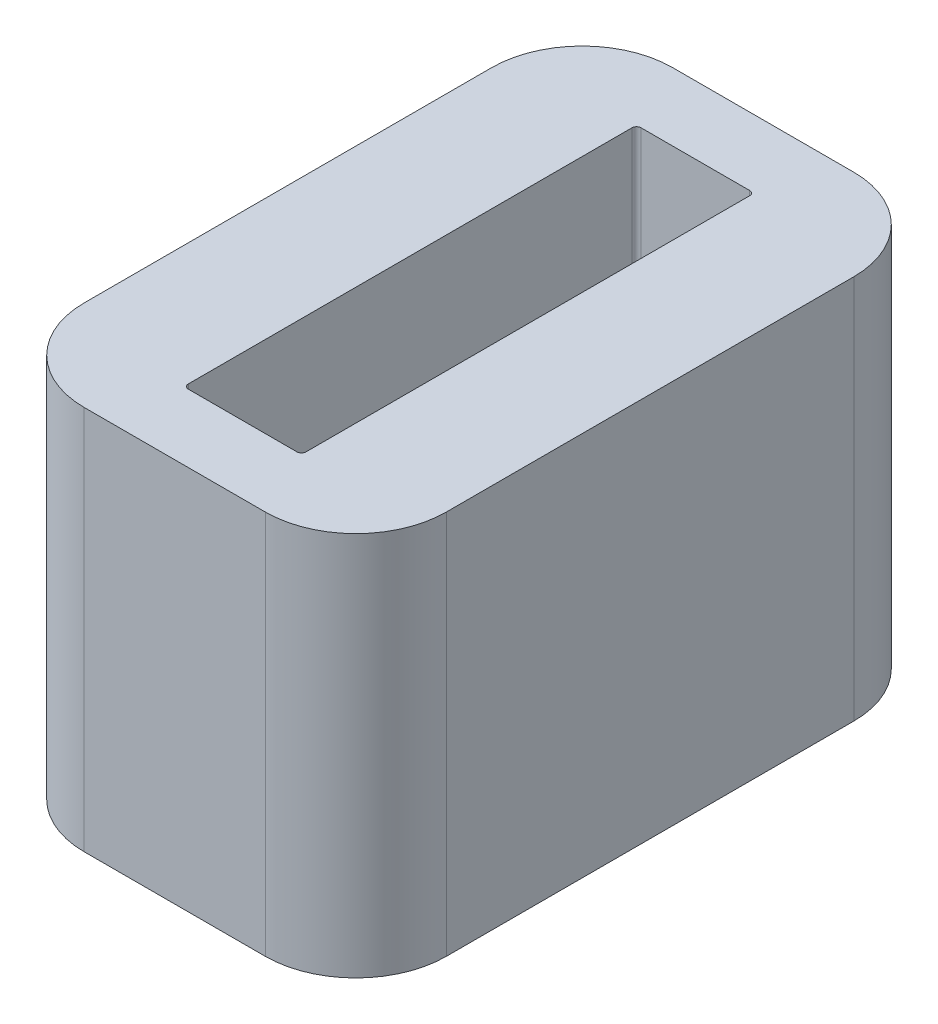
ISO-10303-21;
HEADER;
FILE_DESCRIPTION(('STEP AP214'),'2;1');
FILE_NAME('part.step','',(''),(''),'','','');
FILE_SCHEMA(('AUTOMOTIVE_DESIGN { 1 0 10303 214 1 1 1 1 }'));
ENDSEC;
DATA;
#1=APPLICATION_CONTEXT('core data for automotive mechanical design processes');
#2=APPLICATION_PROTOCOL_DEFINITION('international standard','automotive_design',2000,#1);
#3=PRODUCT_CONTEXT('',#1,'mechanical');
#4=PRODUCT('Part','Part','',(#3));
#5=PRODUCT_RELATED_PRODUCT_CATEGORY('part','',(#4));
#6=PRODUCT_DEFINITION_FORMATION('','',#4);
#7=PRODUCT_DEFINITION_CONTEXT('part definition',#1,'design');
#8=PRODUCT_DEFINITION('design','',#6,#7);
#9=PRODUCT_DEFINITION_SHAPE('','',#8);
#10=(LENGTH_UNIT() NAMED_UNIT(*) SI_UNIT(.MILLI.,.METRE.));
#11=(NAMED_UNIT(*) PLANE_ANGLE_UNIT() SI_UNIT($,.RADIAN.));
#12=(NAMED_UNIT(*) SI_UNIT($,.STERADIAN.) SOLID_ANGLE_UNIT());
#13=UNCERTAINTY_MEASURE_WITH_UNIT(LENGTH_MEASURE(1.E-05),#10,'distance_accuracy_value','');
#14=(GEOMETRIC_REPRESENTATION_CONTEXT(3) GLOBAL_UNCERTAINTY_ASSIGNED_CONTEXT((#13)) GLOBAL_UNIT_ASSIGNED_CONTEXT((#10,
#11,#12)) REPRESENTATION_CONTEXT('',''));
#15=CARTESIAN_POINT('',(0.,0.,0.));
#16=DIRECTION('',(0.,0.,1.));
#17=DIRECTION('',(1.,0.,0.));
#18=AXIS2_PLACEMENT_3D('',#15,#16,#17);
#19=CARTESIAN_POINT('',(87.0727928211845,88.0794752893805,-69.6093677585195));
#20=DIRECTION('',(0.,1.,0.));
#21=DIRECTION('',(0.,0.,1.));
#22=AXIS2_PLACEMENT_3D('',#19,#20,#21);
#23=CYLINDRICAL_SURFACE('',#22,2.);
#24=CARTESIAN_POINT('',(87.0727928211845,96.5794752893805,-69.6093677585195));
#25=DIRECTION('',(0.,1.,0.));
#26=DIRECTION('',(0.,0.,-1.));
#27=AXIS2_PLACEMENT_3D('',#24,#25,#26);
#28=CIRCLE('',#27,2.);
#29=CARTESIAN_POINT('',(85.0727928211845,96.5794752893805,-69.6093677585195));
#30=VERTEX_POINT('',#29);
#31=CARTESIAN_POINT('',(87.0727928211845,96.5794752893805,-67.6093677585195));
#32=VERTEX_POINT('',#31);
#33=EDGE_CURVE('E250',#30,#32,#28,.T.);
#34=ORIENTED_EDGE('',*,*,#33,.F.);
#35=DIRECTION('',(0.,1.,0.));
#36=VECTOR('',#35,1.);
#37=CARTESIAN_POINT('',(85.0727928211845,88.0794752893805,-69.6093677585195));
#38=LINE('',#37,#36);
#39=CARTESIAN_POINT('',(85.0727928211845,88.0794752893805,-69.6093677585195));
#40=VERTEX_POINT('',#39);
#41=EDGE_CURVE('E217',#40,#30,#38,.T.);
#42=ORIENTED_EDGE('',*,*,#41,.F.);
#43=CARTESIAN_POINT('',(87.0727928211845,88.0794752893805,-69.6093677585195));
#44=DIRECTION('',(0.,1.,0.));
#45=DIRECTION('',(0.,0.,-1.));
#46=AXIS2_PLACEMENT_3D('',#43,#44,#45);
#47=CIRCLE('',#46,2.);
#48=CARTESIAN_POINT('',(87.0727928211845,88.0794752893805,-67.6093677585195));
#49=VERTEX_POINT('',#48);
#50=EDGE_CURVE('E210',#40,#49,#47,.T.);
#51=ORIENTED_EDGE('',*,*,#50,.T.);
#52=DIRECTION('',(0.,1.,0.));
#53=VECTOR('',#52,1.);
#54=CARTESIAN_POINT('',(87.0727928211845,88.0794752893805,-67.6093677585195));
#55=LINE('',#54,#53);
#56=EDGE_CURVE('E191',#49,#32,#55,.T.);
#57=ORIENTED_EDGE('',*,*,#56,.T.);
#58=EDGE_LOOP('',(#34,#42,#51,#57));
#59=FACE_BOUND('',#58,.T.);
#60=ADVANCED_FACE('F45',(#59),#23,.T.);
#61=CARTESIAN_POINT('',(85.0727928211845,88.0794752893805,-69.6093677585195));
#62=DIRECTION('',(-1.,0.,0.));
#63=DIRECTION('',(0.,0.,1.));
#64=AXIS2_PLACEMENT_3D('',#61,#62,#63);
#65=PLANE('',#64);
#66=DIRECTION('',(0.,0.,1.));
#67=VECTOR('',#66,1.);
#68=CARTESIAN_POINT('',(85.0727928211845,96.5794752893805,-69.6093677585195));
#69=LINE('',#68,#67);
#70=CARTESIAN_POINT('',(85.0727928211845,96.5794752893805,-78.6093677585195));
#71=VERTEX_POINT('',#70);
#72=EDGE_CURVE('E219',#71,#30,#69,.T.);
#73=ORIENTED_EDGE('',*,*,#72,.F.);
#74=DIRECTION('',(0.,1.,0.));
#75=VECTOR('',#74,1.);
#76=CARTESIAN_POINT('',(85.0727928211845,88.0794752893805,-78.6093677585195));
#77=LINE('',#76,#75);
#78=CARTESIAN_POINT('',(85.0727928211845,88.0794752893805,-78.6093677585195));
#79=VERTEX_POINT('',#78);
#80=EDGE_CURVE('E278',#79,#71,#77,.T.);
#81=ORIENTED_EDGE('',*,*,#80,.F.);
#82=DIRECTION('',(0.,0.,1.));
#83=VECTOR('',#82,1.);
#84=CARTESIAN_POINT('',(85.0727928211845,88.0794752893805,-69.6093677585195));
#85=LINE('',#84,#83);
#86=EDGE_CURVE('E203',#79,#40,#85,.T.);
#87=ORIENTED_EDGE('',*,*,#86,.T.);
#88=ORIENTED_EDGE('',*,*,#41,.T.);
#89=EDGE_LOOP('',(#73,#81,#87,#88));
#90=FACE_BOUND('',#89,.T.);
#91=ADVANCED_FACE('F407',(#90),#65,.T.);
#92=CARTESIAN_POINT('',(87.0727928211845,88.0794752893805,-78.6093677585195));
#93=DIRECTION('',(0.,1.,0.));
#94=DIRECTION('',(0.,0.,1.));
#95=AXIS2_PLACEMENT_3D('',#92,#93,#94);
#96=CYLINDRICAL_SURFACE('',#95,2.00000000000001);
#97=CARTESIAN_POINT('',(87.0727928211845,96.5794752893805,-78.6093677585195));
#98=DIRECTION('',(0.,1.,0.));
#99=DIRECTION('',(0.,0.,-1.));
#100=AXIS2_PLACEMENT_3D('',#97,#98,#99);
#101=CIRCLE('',#100,2.00000000000001);
#102=CARTESIAN_POINT('',(87.0727928211845,96.5794752893805,-80.6093677585195));
#103=VERTEX_POINT('',#102);
#104=EDGE_CURVE('E224',#103,#71,#101,.T.);
#105=ORIENTED_EDGE('',*,*,#104,.F.);
#106=DIRECTION('',(0.,1.,0.));
#107=VECTOR('',#106,1.);
#108=CARTESIAN_POINT('',(87.0727928211845,88.0794752893805,-80.6093677585195));
#109=LINE('',#108,#107);
#110=CARTESIAN_POINT('',(87.0727928211845,88.0794752893805,-80.6093677585195));
#111=VERTEX_POINT('',#110);
#112=EDGE_CURVE('E281',#111,#103,#109,.T.);
#113=ORIENTED_EDGE('',*,*,#112,.F.);
#114=CARTESIAN_POINT('',(87.0727928211845,88.0794752893805,-78.6093677585195));
#115=DIRECTION('',(0.,1.,0.));
#116=DIRECTION('',(0.,0.,-1.));
#117=AXIS2_PLACEMENT_3D('',#114,#115,#116);
#118=CIRCLE('',#117,2.00000000000001);
#119=EDGE_CURVE('E244',#111,#79,#118,.T.);
#120=ORIENTED_EDGE('',*,*,#119,.T.);
#121=ORIENTED_EDGE('',*,*,#80,.T.);
#122=EDGE_LOOP('',(#105,#113,#120,#121));
#123=FACE_BOUND('',#122,.T.);
#124=ADVANCED_FACE('F410',(#123),#96,.T.);
#125=CARTESIAN_POINT('',(87.0727928211845,88.0794752893805,-80.6093677585195));
#126=DIRECTION('',(0.,0.,-1.));
#127=DIRECTION('',(-1.,0.,0.));
#128=AXIS2_PLACEMENT_3D('',#125,#126,#127);
#129=PLANE('',#128);
#130=DIRECTION('',(-1.,0.,0.));
#131=VECTOR('',#130,1.);
#132=CARTESIAN_POINT('',(87.0727928211845,96.5794752893805,-80.6093677585195));
#133=LINE('',#132,#131);
#134=CARTESIAN_POINT('',(91.0727928211845,96.5794752893805,-80.6093677585195));
#135=VERTEX_POINT('',#134);
#136=EDGE_CURVE('E268',#135,#103,#133,.T.);
#137=ORIENTED_EDGE('',*,*,#136,.F.);
#138=DIRECTION('',(0.,1.,0.));
#139=VECTOR('',#138,1.);
#140=CARTESIAN_POINT('',(91.0727928211845,88.0794752893805,-80.6093677585195));
#141=LINE('',#140,#139);
#142=CARTESIAN_POINT('',(91.0727928211845,88.0794752893805,-80.6093677585195));
#143=VERTEX_POINT('',#142);
#144=EDGE_CURVE('E284',#143,#135,#141,.T.);
#145=ORIENTED_EDGE('',*,*,#144,.F.);
#146=DIRECTION('',(-1.,0.,0.));
#147=VECTOR('',#146,1.);
#148=CARTESIAN_POINT('',(87.0727928211845,88.0794752893805,-80.6093677585195));
#149=LINE('',#148,#147);
#150=EDGE_CURVE('E240',#143,#111,#149,.T.);
#151=ORIENTED_EDGE('',*,*,#150,.T.);
#152=ORIENTED_EDGE('',*,*,#112,.T.);
#153=EDGE_LOOP('',(#137,#145,#151,#152));
#154=FACE_BOUND('',#153,.T.);
#155=ADVANCED_FACE('F529',(#154),#129,.T.);
#156=CARTESIAN_POINT('',(91.0727928211845,88.0794752893805,-78.6093677585195));
#157=DIRECTION('',(0.,1.,0.));
#158=DIRECTION('',(0.,0.,1.));
#159=AXIS2_PLACEMENT_3D('',#156,#157,#158);
#160=CYLINDRICAL_SURFACE('',#159,2.00000000000001);
#161=CARTESIAN_POINT('',(91.0727928211845,96.5794752893805,-78.6093677585195));
#162=DIRECTION('',(0.,1.,0.));
#163=DIRECTION('',(0.,0.,-1.));
#164=AXIS2_PLACEMENT_3D('',#161,#162,#163);
#165=CIRCLE('',#164,2.00000000000001);
#166=CARTESIAN_POINT('',(93.0727928211845,96.5794752893805,-78.6093677585195));
#167=VERTEX_POINT('',#166);
#168=EDGE_CURVE('E264',#167,#135,#165,.T.);
#169=ORIENTED_EDGE('',*,*,#168,.F.);
#170=DIRECTION('',(0.,1.,0.));
#171=VECTOR('',#170,1.);
#172=CARTESIAN_POINT('',(93.0727928211845,88.0794752893805,-78.6093677585195));
#173=LINE('',#172,#171);
#174=CARTESIAN_POINT('',(93.0727928211845,88.0794752893805,-78.6093677585195));
#175=VERTEX_POINT('',#174);
#176=EDGE_CURVE('E287',#175,#167,#173,.T.);
#177=ORIENTED_EDGE('',*,*,#176,.F.);
#178=CARTESIAN_POINT('',(91.0727928211845,88.0794752893805,-78.6093677585195));
#179=DIRECTION('',(0.,1.,0.));
#180=DIRECTION('',(0.,0.,-1.));
#181=AXIS2_PLACEMENT_3D('',#178,#179,#180);
#182=CIRCLE('',#181,2.00000000000001);
#183=EDGE_CURVE('E236',#175,#143,#182,.T.);
#184=ORIENTED_EDGE('',*,*,#183,.T.);
#185=ORIENTED_EDGE('',*,*,#144,.T.);
#186=EDGE_LOOP('',(#169,#177,#184,#185));
#187=FACE_BOUND('',#186,.T.);
#188=ADVANCED_FACE('F518',(#187),#160,.T.);
#189=CARTESIAN_POINT('',(93.0727928211845,88.0794752893805,-69.6093677585195));
#190=DIRECTION('',(1.,0.,0.));
#191=DIRECTION('',(0.,0.,-1.));
#192=AXIS2_PLACEMENT_3D('',#189,#190,#191);
#193=PLANE('',#192);
#194=DIRECTION('',(0.,0.,-1.));
#195=VECTOR('',#194,1.);
#196=CARTESIAN_POINT('',(93.0727928211845,96.5794752893805,-69.6093677585195));
#197=LINE('',#196,#195);
#198=CARTESIAN_POINT('',(93.0727928211845,96.5794752893805,-69.6093677585195));
#199=VERTEX_POINT('',#198);
#200=EDGE_CURVE('E260',#199,#167,#197,.T.);
#201=ORIENTED_EDGE('',*,*,#200,.F.);
#202=DIRECTION('',(0.,1.,0.));
#203=VECTOR('',#202,1.);
#204=CARTESIAN_POINT('',(93.0727928211845,88.0794752893805,-69.6093677585195));
#205=LINE('',#204,#203);
#206=CARTESIAN_POINT('',(93.0727928211845,88.0794752893805,-69.6093677585195));
#207=VERTEX_POINT('',#206);
#208=EDGE_CURVE('E290',#207,#199,#205,.T.);
#209=ORIENTED_EDGE('',*,*,#208,.F.);
#210=DIRECTION('',(0.,0.,-1.));
#211=VECTOR('',#210,1.);
#212=CARTESIAN_POINT('',(93.0727928211845,88.0794752893805,-69.6093677585195));
#213=LINE('',#212,#211);
#214=EDGE_CURVE('E232',#207,#175,#213,.T.);
#215=ORIENTED_EDGE('',*,*,#214,.T.);
#216=ORIENTED_EDGE('',*,*,#176,.T.);
#217=EDGE_LOOP('',(#201,#209,#215,#216));
#218=FACE_BOUND('',#217,.T.);
#219=ADVANCED_FACE('F508',(#218),#193,.T.);
#220=CARTESIAN_POINT('',(91.0727928211845,88.0794752893805,-69.6093677585195));
#221=DIRECTION('',(0.,1.,0.));
#222=DIRECTION('',(0.,0.,1.));
#223=AXIS2_PLACEMENT_3D('',#220,#221,#222);
#224=CYLINDRICAL_SURFACE('',#223,2.);
#225=CARTESIAN_POINT('',(91.0727928211845,96.5794752893805,-69.6093677585195));
#226=DIRECTION('',(0.,1.,0.));
#227=DIRECTION('',(0.,0.,1.));
#228=AXIS2_PLACEMENT_3D('',#225,#226,#227);
#229=CIRCLE('',#228,2.);
#230=CARTESIAN_POINT('',(91.0727928211845,96.5794752893805,-67.6093677585195));
#231=VERTEX_POINT('',#230);
#232=EDGE_CURVE('E256',#231,#199,#229,.T.);
#233=ORIENTED_EDGE('',*,*,#232,.F.);
#234=DIRECTION('',(0.,1.,0.));
#235=VECTOR('',#234,1.);
#236=CARTESIAN_POINT('',(91.0727928211845,88.0794752893805,-67.6093677585195));
#237=LINE('',#236,#235);
#238=CARTESIAN_POINT('',(91.0727928211845,88.0794752893805,-67.6093677585195));
#239=VERTEX_POINT('',#238);
#240=EDGE_CURVE('E202',#239,#231,#237,.T.);
#241=ORIENTED_EDGE('',*,*,#240,.F.);
#242=CARTESIAN_POINT('',(91.0727928211845,88.0794752893805,-69.6093677585195));
#243=DIRECTION('',(0.,1.,0.));
#244=DIRECTION('',(0.,0.,1.));
#245=AXIS2_PLACEMENT_3D('',#242,#243,#244);
#246=CIRCLE('',#245,2.);
#247=EDGE_CURVE('E214',#239,#207,#246,.T.);
#248=ORIENTED_EDGE('',*,*,#247,.T.);
#249=ORIENTED_EDGE('',*,*,#208,.T.);
#250=EDGE_LOOP('',(#233,#241,#248,#249));
#251=FACE_BOUND('',#250,.T.);
#252=ADVANCED_FACE('F499',(#251),#224,.T.);
#253=CARTESIAN_POINT('',(87.0727928211845,88.0794752893805,-67.6093677585195));
#254=DIRECTION('',(0.,0.,1.));
#255=DIRECTION('',(1.,0.,0.));
#256=AXIS2_PLACEMENT_3D('',#253,#254,#255);
#257=PLANE('',#256);
#258=DIRECTION('',(1.,0.,0.));
#259=VECTOR('',#258,1.);
#260=CARTESIAN_POINT('',(87.0727928211845,96.5794752893805,-67.6093677585195));
#261=LINE('',#260,#259);
#262=EDGE_CURVE('E196',#32,#231,#261,.T.);
#263=ORIENTED_EDGE('',*,*,#262,.F.);
#264=ORIENTED_EDGE('',*,*,#56,.F.);
#265=DIRECTION('',(1.,0.,0.));
#266=VECTOR('',#265,1.);
#267=CARTESIAN_POINT('',(87.0727928211845,88.0794752893805,-67.6093677585195));
#268=LINE('',#267,#266);
#269=EDGE_CURVE('E194',#49,#239,#268,.T.);
#270=ORIENTED_EDGE('',*,*,#269,.T.);
#271=ORIENTED_EDGE('',*,*,#240,.T.);
#272=EDGE_LOOP('',(#263,#264,#270,#271));
#273=FACE_BOUND('',#272,.T.);
#274=ADVANCED_FACE('F193',(#273),#257,.T.);
#275=CARTESIAN_POINT('',(87.0727928211845,88.0794752893805,-69.6093677585195));
#276=DIRECTION('',(0.,-1.,0.));
#277=DIRECTION('',(0.,0.,-1.));
#278=AXIS2_PLACEMENT_3D('',#275,#276,#277);
#279=PLANE('',#278);
#280=DIRECTION('',(1.,0.,0.));
#281=VECTOR('',#280,1.);
#282=CARTESIAN_POINT('',(87.7727928211845,88.0794752893805,-69.1093677585195));
#283=LINE('',#282,#281);
#284=CARTESIAN_POINT('',(87.8727928211845,88.0794752893805,-69.1093677585195));
#285=VERTEX_POINT('',#284);
#286=CARTESIAN_POINT('',(90.2727928211845,88.0794752893805,-69.1093677585195));
#287=VERTEX_POINT('',#286);
#288=EDGE_CURVE('E253',#285,#287,#283,.T.);
#289=ORIENTED_EDGE('',*,*,#288,.T.);
#290=CARTESIAN_POINT('',(90.2727928211845,88.0794752893805,-69.2093677585195));
#291=DIRECTION('',(0.,-1.,0.));
#292=DIRECTION('',(0.,0.,-1.));
#293=AXIS2_PLACEMENT_3D('',#290,#291,#292);
#294=CIRCLE('',#293,0.1);
#295=CARTESIAN_POINT('',(90.3727928211845,88.0794752893805,-69.2093677585195));
#296=VERTEX_POINT('',#295);
#297=EDGE_CURVE('E324',#287,#296,#294,.F.);
#298=ORIENTED_EDGE('',*,*,#297,.T.);
#299=DIRECTION('',(0.,0.,-1.));
#300=VECTOR('',#299,1.);
#301=CARTESIAN_POINT('',(90.3727928211845,88.0794752893805,-69.1093677585195));
#302=LINE('',#301,#300);
#303=CARTESIAN_POINT('',(90.3727928211845,88.0794752893805,-79.0093677585195));
#304=VERTEX_POINT('',#303);
#305=EDGE_CURVE('E361',#296,#304,#302,.T.);
#306=ORIENTED_EDGE('',*,*,#305,.T.);
#307=CARTESIAN_POINT('',(90.2727928211845,88.0794752893805,-79.0093677585195));
#308=DIRECTION('',(0.,-1.,0.));
#309=DIRECTION('',(0.,0.,-1.));
#310=AXIS2_PLACEMENT_3D('',#307,#308,#309);
#311=CIRCLE('',#310,0.1);
#312=CARTESIAN_POINT('',(90.2727928211845,88.0794752893805,-79.1093677585195));
#313=VERTEX_POINT('',#312);
#314=EDGE_CURVE('E11',#304,#313,#311,.F.);
#315=ORIENTED_EDGE('',*,*,#314,.T.);
#316=DIRECTION('',(-1.,0.,0.));
#317=VECTOR('',#316,1.);
#318=CARTESIAN_POINT('',(87.7727928211845,88.0794752893805,-79.1093677585195));
#319=LINE('',#318,#317);
#320=CARTESIAN_POINT('',(87.8727928211845,88.0794752893805,-79.1093677585195));
#321=VERTEX_POINT('',#320);
#322=EDGE_CURVE('E357',#313,#321,#319,.T.);
#323=ORIENTED_EDGE('',*,*,#322,.T.);
#324=CARTESIAN_POINT('',(87.8727928211845,88.0794752893805,-79.0093677585195));
#325=DIRECTION('',(0.,-1.,0.));
#326=DIRECTION('',(0.,0.,-1.));
#327=AXIS2_PLACEMENT_3D('',#324,#325,#326);
#328=CIRCLE('',#327,0.1);
#329=CARTESIAN_POINT('',(87.7727928211845,88.0794752893805,-79.0093677585195));
#330=VERTEX_POINT('',#329);
#331=EDGE_CURVE('E335',#321,#330,#328,.F.);
#332=ORIENTED_EDGE('',*,*,#331,.T.);
#333=DIRECTION('',(0.,0.,1.));
#334=VECTOR('',#333,1.);
#335=CARTESIAN_POINT('',(87.7727928211845,88.0794752893805,-69.1093677585195));
#336=LINE('',#335,#334);
#337=CARTESIAN_POINT('',(87.7727928211845,88.0794752893805,-69.2093677585195));
#338=VERTEX_POINT('',#337);
#339=EDGE_CURVE('E360',#330,#338,#336,.T.);
#340=ORIENTED_EDGE('',*,*,#339,.T.);
#341=CARTESIAN_POINT('',(87.8727928211845,88.0794752893805,-69.2093677585195));
#342=DIRECTION('',(0.,-1.,0.));
#343=DIRECTION('',(0.,0.,-1.));
#344=AXIS2_PLACEMENT_3D('',#341,#342,#343);
#345=CIRCLE('',#344,0.1);
#346=EDGE_CURVE('E329',#338,#285,#345,.F.);
#347=ORIENTED_EDGE('',*,*,#346,.T.);
#348=EDGE_LOOP('',(#289,#298,#306,#315,#323,#332,#340,#347));
#349=FACE_BOUND('',#348,.T.);
#350=ORIENTED_EDGE('',*,*,#50,.F.);
#351=ORIENTED_EDGE('',*,*,#86,.F.);
#352=ORIENTED_EDGE('',*,*,#119,.F.);
#353=ORIENTED_EDGE('',*,*,#150,.F.);
#354=ORIENTED_EDGE('',*,*,#183,.F.);
#355=ORIENTED_EDGE('',*,*,#214,.F.);
#356=ORIENTED_EDGE('',*,*,#247,.F.);
#357=ORIENTED_EDGE('',*,*,#269,.F.);
#358=EDGE_LOOP('',(#350,#351,#352,#353,#354,#355,#356,#357));
#359=FACE_BOUND('',#358,.T.);
#360=ADVANCED_FACE('F208',(#349,#359),#279,.T.);
#361=CARTESIAN_POINT('',(87.0727928211845,96.5794752893805,-69.6093677585195));
#362=DIRECTION('',(0.,-1.,0.));
#363=DIRECTION('',(0.,0.,-1.));
#364=AXIS2_PLACEMENT_3D('',#361,#362,#363);
#365=PLANE('',#364);
#366=DIRECTION('',(-1.,0.,0.));
#367=VECTOR('',#366,1.);
#368=CARTESIAN_POINT('',(87.7727928211845,96.5794752893805,-79.1093677585195));
#369=LINE('',#368,#367);
#370=CARTESIAN_POINT('',(90.2727928211845,96.5794752893805,-79.1093677585195));
#371=VERTEX_POINT('',#370);
#372=CARTESIAN_POINT('',(87.8727928211845,96.5794752893805,-79.1093677585195));
#373=VERTEX_POINT('',#372);
#374=EDGE_CURVE('E346',#371,#373,#369,.T.);
#375=ORIENTED_EDGE('',*,*,#374,.F.);
#376=CARTESIAN_POINT('',(90.2727928211845,96.5794752893805,-79.0093677585195));
#377=DIRECTION('',(0.,-1.,0.));
#378=DIRECTION('',(0.,0.,-1.));
#379=AXIS2_PLACEMENT_3D('',#376,#377,#378);
#380=CIRCLE('',#379,0.1);
#381=CARTESIAN_POINT('',(90.3727928211845,96.5794752893805,-79.0093677585195));
#382=VERTEX_POINT('',#381);
#383=EDGE_CURVE('E54',#371,#382,#380,.T.);
#384=ORIENTED_EDGE('',*,*,#383,.T.);
#385=DIRECTION('',(0.,0.,-1.));
#386=VECTOR('',#385,1.);
#387=CARTESIAN_POINT('',(90.3727928211845,96.5794752893805,-69.1093677585195));
#388=LINE('',#387,#386);
#389=CARTESIAN_POINT('',(90.3727928211845,96.5794752893805,-69.2093677585195));
#390=VERTEX_POINT('',#389);
#391=EDGE_CURVE('E345',#390,#382,#388,.T.);
#392=ORIENTED_EDGE('',*,*,#391,.F.);
#393=CARTESIAN_POINT('',(90.2727928211845,96.5794752893805,-69.2093677585195));
#394=DIRECTION('',(0.,-1.,0.));
#395=DIRECTION('',(0.,0.,-1.));
#396=AXIS2_PLACEMENT_3D('',#393,#394,#395);
#397=CIRCLE('',#396,0.1);
#398=CARTESIAN_POINT('',(90.2727928211845,96.5794752893805,-69.1093677585195));
#399=VERTEX_POINT('',#398);
#400=EDGE_CURVE('E321',#390,#399,#397,.T.);
#401=ORIENTED_EDGE('',*,*,#400,.T.);
#402=DIRECTION('',(1.,0.,0.));
#403=VECTOR('',#402,1.);
#404=CARTESIAN_POINT('',(87.7727928211845,96.5794752893805,-69.1093677585195));
#405=LINE('',#404,#403);
#406=CARTESIAN_POINT('',(87.8727928211845,96.5794752893805,-69.1093677585195));
#407=VERTEX_POINT('',#406);
#408=EDGE_CURVE('E227',#407,#399,#405,.T.);
#409=ORIENTED_EDGE('',*,*,#408,.F.);
#410=CARTESIAN_POINT('',(87.8727928211845,96.5794752893805,-69.2093677585195));
#411=DIRECTION('',(0.,-1.,0.));
#412=DIRECTION('',(0.,0.,-1.));
#413=AXIS2_PLACEMENT_3D('',#410,#411,#412);
#414=CIRCLE('',#413,0.1);
#415=CARTESIAN_POINT('',(87.7727928211845,96.5794752893805,-69.2093677585195));
#416=VERTEX_POINT('',#415);
#417=EDGE_CURVE('E326',#407,#416,#414,.T.);
#418=ORIENTED_EDGE('',*,*,#417,.T.);
#419=DIRECTION('',(0.,0.,1.));
#420=VECTOR('',#419,1.);
#421=CARTESIAN_POINT('',(87.7727928211845,96.5794752893805,-69.1093677585195));
#422=LINE('',#421,#420);
#423=CARTESIAN_POINT('',(87.7727928211845,96.5794752893805,-79.0093677585195));
#424=VERTEX_POINT('',#423);
#425=EDGE_CURVE('E372',#424,#416,#422,.T.);
#426=ORIENTED_EDGE('',*,*,#425,.F.);
#427=CARTESIAN_POINT('',(87.8727928211845,96.5794752893805,-79.0093677585195));
#428=DIRECTION('',(0.,-1.,0.));
#429=DIRECTION('',(0.,0.,-1.));
#430=AXIS2_PLACEMENT_3D('',#427,#428,#429);
#431=CIRCLE('',#430,0.1);
#432=EDGE_CURVE('E332',#424,#373,#431,.T.);
#433=ORIENTED_EDGE('',*,*,#432,.T.);
#434=EDGE_LOOP('',(#375,#384,#392,#401,#409,#418,#426,#433));
#435=FACE_BOUND('',#434,.T.);
#436=ORIENTED_EDGE('',*,*,#33,.T.);
#437=ORIENTED_EDGE('',*,*,#262,.T.);
#438=ORIENTED_EDGE('',*,*,#232,.T.);
#439=ORIENTED_EDGE('',*,*,#200,.T.);
#440=ORIENTED_EDGE('',*,*,#168,.T.);
#441=ORIENTED_EDGE('',*,*,#136,.T.);
#442=ORIENTED_EDGE('',*,*,#104,.T.);
#443=ORIENTED_EDGE('',*,*,#72,.T.);
#444=EDGE_LOOP('',(#436,#437,#438,#439,#440,#441,#442,#443));
#445=FACE_BOUND('',#444,.T.);
#446=ADVANCED_FACE('F343',(#435,#445),#365,.F.);
#447=CARTESIAN_POINT('',(90.3727928211845,88.0794752893805,-69.1093677585195));
#448=DIRECTION('',(1.,0.,0.));
#449=DIRECTION('',(0.,0.,-1.));
#450=AXIS2_PLACEMENT_3D('',#447,#448,#449);
#451=PLANE('',#450);
#452=ORIENTED_EDGE('',*,*,#305,.F.);
#453=DIRECTION('',(0.,1.,0.));
#454=VECTOR('',#453,1.);
#455=CARTESIAN_POINT('',(90.3727928211845,96.5794752893805,-69.2093677585195));
#456=LINE('',#455,#454);
#457=EDGE_CURVE('E297',#296,#390,#456,.T.);
#458=ORIENTED_EDGE('',*,*,#457,.T.);
#459=ORIENTED_EDGE('',*,*,#391,.T.);
#460=DIRECTION('',(0.,1.,0.));
#461=VECTOR('',#460,1.);
#462=CARTESIAN_POINT('',(90.3727928211845,88.0794752893805,-79.0093677585195));
#463=LINE('',#462,#461);
#464=EDGE_CURVE('E277',#382,#304,#463,.F.);
#465=ORIENTED_EDGE('',*,*,#464,.T.);
#466=EDGE_LOOP('',(#452,#458,#459,#465));
#467=FACE_BOUND('',#466,.T.);
#468=ADVANCED_FACE('F352',(#467),#451,.F.);
#469=CARTESIAN_POINT('',(87.7727928211845,88.0794752893805,-69.1093677585195));
#470=DIRECTION('',(0.,0.,1.));
#471=DIRECTION('',(1.,0.,0.));
#472=AXIS2_PLACEMENT_3D('',#469,#470,#471);
#473=PLANE('',#472);
#474=ORIENTED_EDGE('',*,*,#408,.T.);
#475=DIRECTION('',(0.,1.,0.));
#476=VECTOR('',#475,1.);
#477=CARTESIAN_POINT('',(90.2727928211845,88.0794752893805,-69.1093677585195));
#478=LINE('',#477,#476);
#479=EDGE_CURVE('E305',#399,#287,#478,.F.);
#480=ORIENTED_EDGE('',*,*,#479,.T.);
#481=ORIENTED_EDGE('',*,*,#288,.F.);
#482=DIRECTION('',(0.,1.,0.));
#483=VECTOR('',#482,1.);
#484=CARTESIAN_POINT('',(87.8727928211845,96.5794752893805,-69.1093677585195));
#485=LINE('',#484,#483);
#486=EDGE_CURVE('E301',#285,#407,#485,.T.);
#487=ORIENTED_EDGE('',*,*,#486,.T.);
#488=EDGE_LOOP('',(#474,#480,#481,#487));
#489=FACE_BOUND('',#488,.T.);
#490=ADVANCED_FACE('F383',(#489),#473,.F.);
#491=CARTESIAN_POINT('',(87.7727928211845,88.0794752893805,-69.1093677585195));
#492=DIRECTION('',(-1.,0.,0.));
#493=DIRECTION('',(0.,0.,1.));
#494=AXIS2_PLACEMENT_3D('',#491,#492,#493);
#495=PLANE('',#494);
#496=ORIENTED_EDGE('',*,*,#425,.T.);
#497=DIRECTION('',(0.,1.,0.));
#498=VECTOR('',#497,1.);
#499=CARTESIAN_POINT('',(87.7727928211845,88.0794752893805,-69.2093677585195));
#500=LINE('',#499,#498);
#501=EDGE_CURVE('E312',#416,#338,#500,.F.);
#502=ORIENTED_EDGE('',*,*,#501,.T.);
#503=ORIENTED_EDGE('',*,*,#339,.F.);
#504=DIRECTION('',(0.,1.,0.));
#505=VECTOR('',#504,1.);
#506=CARTESIAN_POINT('',(87.7727928211845,96.5794752893805,-79.0093677585195));
#507=LINE('',#506,#505);
#508=EDGE_CURVE('E308',#330,#424,#507,.T.);
#509=ORIENTED_EDGE('',*,*,#508,.T.);
#510=EDGE_LOOP('',(#496,#502,#503,#509));
#511=FACE_BOUND('',#510,.T.);
#512=ADVANCED_FACE('F396',(#511),#495,.F.);
#513=CARTESIAN_POINT('',(87.7727928211845,88.0794752893805,-79.1093677585195));
#514=DIRECTION('',(0.,0.,-1.));
#515=DIRECTION('',(-1.,0.,0.));
#516=AXIS2_PLACEMENT_3D('',#513,#514,#515);
#517=PLANE('',#516);
#518=ORIENTED_EDGE('',*,*,#374,.T.);
#519=DIRECTION('',(0.,1.,0.));
#520=VECTOR('',#519,1.);
#521=CARTESIAN_POINT('',(87.8727928211845,88.0794752893805,-79.1093677585195));
#522=LINE('',#521,#520);
#523=EDGE_CURVE('E64',#373,#321,#522,.F.);
#524=ORIENTED_EDGE('',*,*,#523,.T.);
#525=ORIENTED_EDGE('',*,*,#322,.F.);
#526=DIRECTION('',(0.,1.,0.));
#527=VECTOR('',#526,1.);
#528=CARTESIAN_POINT('',(90.2727928211845,96.5794752893805,-79.1093677585195));
#529=LINE('',#528,#527);
#530=EDGE_CURVE('E315',#313,#371,#529,.T.);
#531=ORIENTED_EDGE('',*,*,#530,.T.);
#532=EDGE_LOOP('',(#518,#524,#525,#531));
#533=FACE_BOUND('',#532,.T.);
#534=ADVANCED_FACE('F356',(#533),#517,.F.);
#535=CARTESIAN_POINT('',(90.2727928211845,88.0794752893805,-69.2093677585195));
#536=DIRECTION('',(0.,-1.,0.));
#537=DIRECTION('',(0.,0.,-1.));
#538=AXIS2_PLACEMENT_3D('',#535,#536,#537);
#539=CYLINDRICAL_SURFACE('',#538,0.1);
#540=ORIENTED_EDGE('',*,*,#297,.F.);
#541=ORIENTED_EDGE('',*,*,#479,.F.);
#542=ORIENTED_EDGE('',*,*,#400,.F.);
#543=ORIENTED_EDGE('',*,*,#457,.F.);
#544=EDGE_LOOP('',(#540,#541,#542,#543));
#545=FACE_BOUND('',#544,.T.);
#546=ADVANCED_FACE('F388',(#545),#539,.F.);
#547=CARTESIAN_POINT('',(87.8727928211845,88.0794752893805,-69.2093677585195));
#548=DIRECTION('',(0.,-1.,0.));
#549=DIRECTION('',(0.,0.,-1.));
#550=AXIS2_PLACEMENT_3D('',#547,#548,#549);
#551=CYLINDRICAL_SURFACE('',#550,0.1);
#552=ORIENTED_EDGE('',*,*,#346,.F.);
#553=ORIENTED_EDGE('',*,*,#501,.F.);
#554=ORIENTED_EDGE('',*,*,#417,.F.);
#555=ORIENTED_EDGE('',*,*,#486,.F.);
#556=EDGE_LOOP('',(#552,#553,#554,#555));
#557=FACE_BOUND('',#556,.T.);
#558=ADVANCED_FACE('F391',(#557),#551,.F.);
#559=CARTESIAN_POINT('',(87.8727928211845,88.0794752893805,-79.0093677585195));
#560=DIRECTION('',(0.,-1.,0.));
#561=DIRECTION('',(0.,0.,-1.));
#562=AXIS2_PLACEMENT_3D('',#559,#560,#561);
#563=CYLINDRICAL_SURFACE('',#562,0.1);
#564=ORIENTED_EDGE('',*,*,#331,.F.);
#565=ORIENTED_EDGE('',*,*,#523,.F.);
#566=ORIENTED_EDGE('',*,*,#432,.F.);
#567=ORIENTED_EDGE('',*,*,#508,.F.);
#568=EDGE_LOOP('',(#564,#565,#566,#567));
#569=FACE_BOUND('',#568,.T.);
#570=ADVANCED_FACE('F394',(#569),#563,.F.);
#571=CARTESIAN_POINT('',(90.2727928211845,88.0794752893805,-79.0093677585195));
#572=DIRECTION('',(0.,-1.,0.));
#573=DIRECTION('',(0.,0.,-1.));
#574=AXIS2_PLACEMENT_3D('',#571,#572,#573);
#575=CYLINDRICAL_SURFACE('',#574,0.1);
#576=ORIENTED_EDGE('',*,*,#314,.F.);
#577=ORIENTED_EDGE('',*,*,#464,.F.);
#578=ORIENTED_EDGE('',*,*,#383,.F.);
#579=ORIENTED_EDGE('',*,*,#530,.F.);
#580=EDGE_LOOP('',(#576,#577,#578,#579));
#581=FACE_BOUND('',#580,.T.);
#582=ADVANCED_FACE('F47',(#581),#575,.F.);
#583=CLOSED_SHELL('',(#60,#91,#124,#155,#188,#219,#252,#274,#360,#446,#468,#490,#512,#534,#546,
#558,#570,#582));
#584=MANIFOLD_SOLID_BREP('B2',#583);
#585=ADVANCED_BREP_SHAPE_REPRESENTATION('',(#18,#584),#14);
#586=SHAPE_DEFINITION_REPRESENTATION(#9,#585);
ENDSEC;
END-ISO-10303-21;
